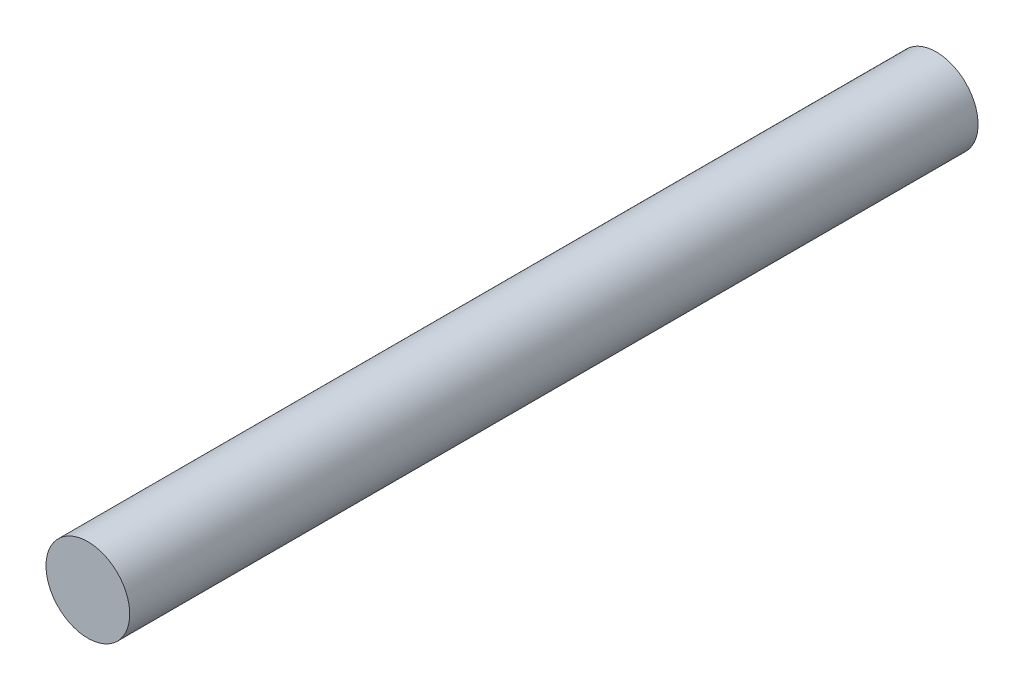
ISO-10303-21;
HEADER;
FILE_DESCRIPTION(('STEP AP214'),'2;1');
FILE_NAME('part.step','',(''),(''),'','','');
FILE_SCHEMA(('AUTOMOTIVE_DESIGN { 1 0 10303 214 1 1 1 1 }'));
ENDSEC;
DATA;
#1=APPLICATION_CONTEXT('core data for automotive mechanical design processes');
#2=APPLICATION_PROTOCOL_DEFINITION('international standard','automotive_design',2000,#1);
#3=PRODUCT_CONTEXT('',#1,'mechanical');
#4=PRODUCT('Part','Part','',(#3));
#5=PRODUCT_RELATED_PRODUCT_CATEGORY('part','',(#4));
#6=PRODUCT_DEFINITION_FORMATION('','',#4);
#7=PRODUCT_DEFINITION_CONTEXT('part definition',#1,'design');
#8=PRODUCT_DEFINITION('design','',#6,#7);
#9=PRODUCT_DEFINITION_SHAPE('','',#8);
#10=(LENGTH_UNIT() NAMED_UNIT(*) SI_UNIT(.MILLI.,.METRE.));
#11=(NAMED_UNIT(*) PLANE_ANGLE_UNIT() SI_UNIT($,.RADIAN.));
#12=(NAMED_UNIT(*) SI_UNIT($,.STERADIAN.) SOLID_ANGLE_UNIT());
#13=UNCERTAINTY_MEASURE_WITH_UNIT(LENGTH_MEASURE(1.E-05),#10,'distance_accuracy_value','');
#14=(GEOMETRIC_REPRESENTATION_CONTEXT(3) GLOBAL_UNCERTAINTY_ASSIGNED_CONTEXT((#13)) GLOBAL_UNIT_ASSIGNED_CONTEXT((#10,
#11,#12)) REPRESENTATION_CONTEXT('',''));
#15=CARTESIAN_POINT('',(0.,0.,0.));
#16=DIRECTION('',(0.,0.,1.));
#17=DIRECTION('',(1.,0.,0.));
#18=AXIS2_PLACEMENT_3D('',#15,#16,#17);
#19=CARTESIAN_POINT('',(0.,0.,7.6));
#20=DIRECTION('',(0.,0.,-1.));
#21=DIRECTION('',(-1.,0.,0.));
#22=AXIS2_PLACEMENT_3D('',#19,#20,#21);
#23=PLANE('',#22);
#24=CARTESIAN_POINT('',(0.,0.,7.6));
#25=DIRECTION('',(0.,0.,-1.));
#26=DIRECTION('',(-1.,0.,0.));
#27=AXIS2_PLACEMENT_3D('',#24,#25,#26);
#28=CIRCLE('',#27,0.75);
#29=CARTESIAN_POINT('',(-0.75,0.,7.6));
#30=VERTEX_POINT('',#29);
#31=EDGE_CURVE('E18',#30,#30,#28,.T.);
#32=ORIENTED_EDGE('',*,*,#31,.F.);
#33=EDGE_LOOP('',(#32));
#34=FACE_BOUND('',#33,.T.);
#35=ADVANCED_FACE('F15',(#34),#23,.F.);
#36=CARTESIAN_POINT('',(0.,0.,-7.6));
#37=DIRECTION('',(0.,0.,-1.));
#38=DIRECTION('',(-1.,0.,0.));
#39=AXIS2_PLACEMENT_3D('',#36,#37,#38);
#40=PLANE('',#39);
#41=CARTESIAN_POINT('',(0.,0.,-7.6));
#42=DIRECTION('',(0.,0.,-1.));
#43=DIRECTION('',(-1.,0.,0.));
#44=AXIS2_PLACEMENT_3D('',#41,#42,#43);
#45=CIRCLE('',#44,0.75);
#46=CARTESIAN_POINT('',(-0.75,0.,-7.6));
#47=VERTEX_POINT('',#46);
#48=EDGE_CURVE('E10',#47,#47,#45,.F.);
#49=ORIENTED_EDGE('',*,*,#48,.F.);
#50=EDGE_LOOP('',(#49));
#51=FACE_BOUND('',#50,.T.);
#52=ADVANCED_FACE('F30',(#51),#40,.T.);
#53=CARTESIAN_POINT('',(0.,0.,8.36));
#54=DIRECTION('',(0.,0.,-1.));
#55=DIRECTION('',(-1.,0.,0.));
#56=AXIS2_PLACEMENT_3D('',#53,#54,#55);
#57=CYLINDRICAL_SURFACE('',#56,0.75);
#58=ORIENTED_EDGE('',*,*,#31,.T.);
#59=EDGE_LOOP('',(#58));
#60=FACE_BOUND('',#59,.T.);
#61=ORIENTED_EDGE('',*,*,#48,.T.);
#62=EDGE_LOOP('',(#61));
#63=FACE_BOUND('',#62,.T.);
#64=ADVANCED_FACE('F27',(#60,#63),#57,.T.);
#65=CLOSED_SHELL('',(#35,#52,#64));
#66=MANIFOLD_SOLID_BREP('B1',#65);
#67=ADVANCED_BREP_SHAPE_REPRESENTATION('',(#18,#66),#14);
#68=SHAPE_DEFINITION_REPRESENTATION(#9,#67);
ENDSEC;
END-ISO-10303-21;
